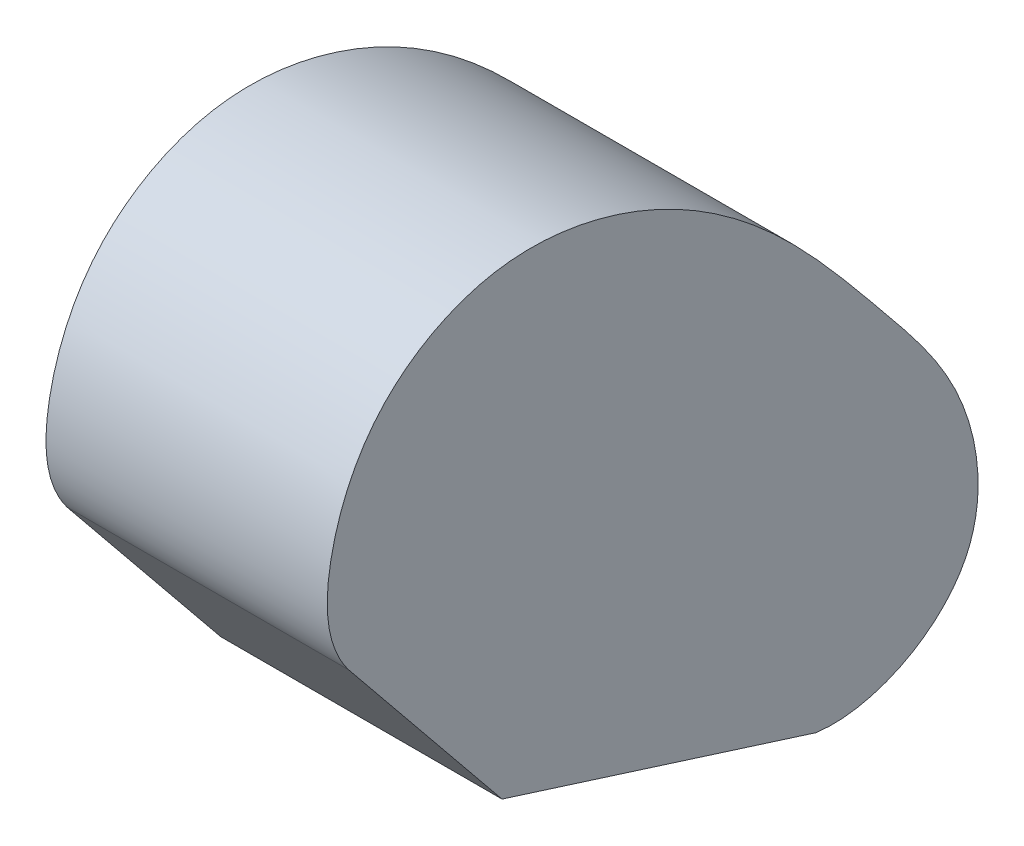
ISO-10303-21;
HEADER;
FILE_DESCRIPTION(('STEP AP214'),'2;1');
FILE_NAME('part.step','',(''),(''),'','','');
FILE_SCHEMA(('AUTOMOTIVE_DESIGN { 1 0 10303 214 1 1 1 1 }'));
ENDSEC;
DATA;
#1=APPLICATION_CONTEXT('core data for automotive mechanical design processes');
#2=APPLICATION_PROTOCOL_DEFINITION('international standard','automotive_design',2000,#1);
#3=PRODUCT_CONTEXT('',#1,'mechanical');
#4=PRODUCT('Part','Part','',(#3));
#5=PRODUCT_RELATED_PRODUCT_CATEGORY('part','',(#4));
#6=PRODUCT_DEFINITION_FORMATION('','',#4);
#7=PRODUCT_DEFINITION_CONTEXT('part definition',#1,'design');
#8=PRODUCT_DEFINITION('design','',#6,#7);
#9=PRODUCT_DEFINITION_SHAPE('','',#8);
#10=(LENGTH_UNIT() NAMED_UNIT(*) SI_UNIT(.MILLI.,.METRE.));
#11=(NAMED_UNIT(*) PLANE_ANGLE_UNIT() SI_UNIT($,.RADIAN.));
#12=(NAMED_UNIT(*) SI_UNIT($,.STERADIAN.) SOLID_ANGLE_UNIT());
#13=UNCERTAINTY_MEASURE_WITH_UNIT(LENGTH_MEASURE(1.E-05),#10,'distance_accuracy_value','');
#14=(GEOMETRIC_REPRESENTATION_CONTEXT(3) GLOBAL_UNCERTAINTY_ASSIGNED_CONTEXT((#13)) GLOBAL_UNIT_ASSIGNED_CONTEXT((#10,
#11,#12)) REPRESENTATION_CONTEXT('',''));
#15=CARTESIAN_POINT('',(0.,0.,0.));
#16=DIRECTION('',(0.,0.,1.));
#17=DIRECTION('',(1.,0.,0.));
#18=AXIS2_PLACEMENT_3D('',#15,#16,#17);
#19=CARTESIAN_POINT('',(-31.75,27.94,40.9761067500312));
#20=DIRECTION('',(0.,-0.630819115821945,0.775929921522311));
#21=DIRECTION('',(0.,-0.775929921522311,-0.630819115821945));
#22=AXIS2_PLACEMENT_3D('',#19,#20,#21);
#23=PLANE('',#22);
#24=DIRECTION('',(0.,-0.775929921522311,-0.630819115821945));
#25=VECTOR('',#24,1.);
#26=CARTESIAN_POINT('',(0.,27.94,40.9761067500312));
#27=LINE('',#26,#25);
#28=CARTESIAN_POINT('',(0.,49.2643519443853,58.312477556098));
#29=VERTEX_POINT('',#28);
#30=CARTESIAN_POINT('',(0.,27.94,40.9761067500312));
#31=VERTEX_POINT('',#30);
#32=EDGE_CURVE('E169',#29,#31,#27,.T.);
#33=ORIENTED_EDGE('',*,*,#32,.F.);
#34=DIRECTION('',(1.,0.,0.));
#35=VECTOR('',#34,1.);
#36=CARTESIAN_POINT('',(-31.75,49.2643519443853,58.312477556098));
#37=LINE('',#36,#35);
#38=CARTESIAN_POINT('',(-31.75,49.2643519443853,58.312477556098));
#39=VERTEX_POINT('',#38);
#40=EDGE_CURVE('E11',#39,#29,#37,.T.);
#41=ORIENTED_EDGE('',*,*,#40,.F.);
#42=DIRECTION('',(0.,-0.775929921522311,-0.630819115821945));
#43=VECTOR('',#42,1.);
#44=CARTESIAN_POINT('',(-31.75,27.94,40.9761067500312));
#45=LINE('',#44,#43);
#46=CARTESIAN_POINT('',(-31.75,27.94,40.9761067500312));
#47=VERTEX_POINT('',#46);
#48=EDGE_CURVE('E186',#39,#47,#45,.T.);
#49=ORIENTED_EDGE('',*,*,#48,.T.);
#50=DIRECTION('',(1.,0.,0.));
#51=VECTOR('',#50,1.);
#52=CARTESIAN_POINT('',(-31.75,27.94,40.9761067500312));
#53=LINE('',#52,#51);
#54=EDGE_CURVE('E42',#47,#31,#53,.T.);
#55=ORIENTED_EDGE('',*,*,#54,.T.);
#56=EDGE_LOOP('',(#33,#41,#49,#55));
#57=FACE_BOUND('',#56,.T.);
#58=ADVANCED_FACE('F39',(#57),#23,.T.);
#59=CARTESIAN_POINT('',(-31.75,16.7139818303603,5.54197032240626));
#60=CARTESIAN_POINT('',(-31.75,15.8257700396885,-0.93874411623954));
#61=CARTESIAN_POINT('',(-31.75,22.4496600064494,-14.4146521354421));
#62=CARTESIAN_POINT('',(-31.75,41.6895685775078,-12.200560018352));
#63=CARTESIAN_POINT('',(-31.75,55.1681957360806,-1.10441590440819));
#64=CARTESIAN_POINT('',(-31.75,69.3524212723375,10.3518692971981));
#65=CARTESIAN_POINT('',(-31.75,79.1513261886316,26.0626077224158));
#66=CARTESIAN_POINT('',(-31.75,81.505964049788,42.1636951200786));
#67=CARTESIAN_POINT('',(-31.75,74.0344326487383,55.5377323773982));
#68=CARTESIAN_POINT('',(-31.75,61.645538599711,61.1643579791778));
#69=CARTESIAN_POINT('',(-31.75,52.8133191500423,60.979470458901));
#70=CARTESIAN_POINT('',(-31.75,49.2643519443853,58.312477556098));
#71=B_SPLINE_CURVE_WITH_KNOTS('',3,(#59,#60,#61,#62,#63,#64,#65,#66,#67,#68,#69,#70),
.UNSPECIFIED.,.F.,.F.,(4,1,1,1,1,1,1,1,1,4),(0.,0.138773670260173,0.240892544513557,
0.351714633890988,0.50238750722408,0.616929549708268,0.730575478148498,0.822531503011914,
0.914096346149057,1.),.UNSPECIFIED.);
#72=DIRECTION('',(1.,0.,0.));
#73=VECTOR('',#72,1.);
#74=SURFACE_OF_LINEAR_EXTRUSION('',#71,#73);
#75=CARTESIAN_POINT('',(0.,16.7139818303603,5.54197032240626));
#76=CARTESIAN_POINT('',(0.,15.8257700396885,-0.93874411623954));
#77=CARTESIAN_POINT('',(0.,22.4496600064494,-14.4146521354421));
#78=CARTESIAN_POINT('',(0.,41.6895685775078,-12.200560018352));
#79=CARTESIAN_POINT('',(0.,55.1681957360806,-1.10441590440819));
#80=CARTESIAN_POINT('',(0.,69.3524212723375,10.3518692971981));
#81=CARTESIAN_POINT('',(0.,79.1513261886316,26.0626077224158));
#82=CARTESIAN_POINT('',(0.,81.505964049788,42.1636951200786));
#83=CARTESIAN_POINT('',(0.,74.0344326487383,55.5377323773982));
#84=CARTESIAN_POINT('',(0.,61.645538599711,61.1643579791778));
#85=CARTESIAN_POINT('',(0.,52.8133191500423,60.979470458901));
#86=CARTESIAN_POINT('',(0.,49.2643519443853,58.312477556098));
#87=B_SPLINE_CURVE_WITH_KNOTS('',3,(#75,#76,#77,#78,#79,#80,#81,#82,#83,#84,#85,#86),
.UNSPECIFIED.,.F.,.F.,(4,1,1,1,1,1,1,1,1,4),(0.,0.138773670260173,0.240892544513557,
0.351714633890988,0.50238750722408,0.616929549708268,0.730575478148498,0.822531503011914,
0.914096346149057,1.),.UNSPECIFIED.);
#88=CARTESIAN_POINT('',(0.,16.7139818303603,5.54197032240625));
#89=VERTEX_POINT('',#88);
#90=EDGE_CURVE('E181',#89,#29,#87,.T.);
#91=ORIENTED_EDGE('',*,*,#90,.F.);
#92=DIRECTION('',(1.,0.,0.));
#93=VECTOR('',#92,1.);
#94=CARTESIAN_POINT('',(-31.75,16.7139818303603,5.54197032240625));
#95=LINE('',#94,#93);
#96=CARTESIAN_POINT('',(-31.75,16.7139818303603,5.54197032240625));
#97=VERTEX_POINT('',#96);
#98=EDGE_CURVE('E48',#97,#89,#95,.T.);
#99=ORIENTED_EDGE('',*,*,#98,.F.);
#100=EDGE_CURVE('E160',#97,#39,#71,.T.);
#101=ORIENTED_EDGE('',*,*,#100,.T.);
#102=ORIENTED_EDGE('',*,*,#40,.T.);
#103=EDGE_LOOP('',(#91,#99,#101,#102));
#104=FACE_BOUND('',#103,.T.);
#105=ADVANCED_FACE('F157',(#104),#74,.T.);
#106=CARTESIAN_POINT('',(-31.75,27.94,40.9761067500312));
#107=DIRECTION('',(0.,-0.953301889031257,0.302019052990763));
#108=DIRECTION('',(0.,-0.302019052990763,-0.953301889031257));
#109=AXIS2_PLACEMENT_3D('',#106,#107,#108);
#110=PLANE('',#109);
#111=DIRECTION('',(0.,-0.302019052990763,-0.953301889031257));
#112=VECTOR('',#111,1.);
#113=CARTESIAN_POINT('',(0.,27.94,40.9761067500312));
#114=LINE('',#113,#112);
#115=EDGE_CURVE('E176',#31,#89,#114,.T.);
#116=ORIENTED_EDGE('',*,*,#115,.F.);
#117=ORIENTED_EDGE('',*,*,#54,.F.);
#118=DIRECTION('',(0.,-0.302019052990763,-0.953301889031257));
#119=VECTOR('',#118,1.);
#120=CARTESIAN_POINT('',(-31.75,27.94,40.9761067500312));
#121=LINE('',#120,#119);
#122=EDGE_CURVE('E167',#47,#97,#121,.T.);
#123=ORIENTED_EDGE('',*,*,#122,.T.);
#124=ORIENTED_EDGE('',*,*,#98,.T.);
#125=EDGE_LOOP('',(#116,#117,#123,#124));
#126=FACE_BOUND('',#125,.T.);
#127=ADVANCED_FACE('F152',(#126),#110,.T.);
#128=CARTESIAN_POINT('',(-31.75,69.4777145382106,12.1321601386259));
#129=DIRECTION('',(1.,0.,0.));
#130=DIRECTION('',(0.,0.,-1.));
#131=AXIS2_PLACEMENT_3D('',#128,#129,#130);
#132=PLANE('',#131);
#133=DIRECTION('',(0.,-1.,0.));
#134=VECTOR('',#133,1.);
#135=CARTESIAN_POINT('',(-31.75,63.410804486409,12.8234805598399));
#136=LINE('',#135,#134);
#137=CARTESIAN_POINT('',(-31.75,63.410804486409,12.8234805598399));
#138=VERTEX_POINT('',#137);
#139=CARTESIAN_POINT('',(-31.75,30.58978975289,12.8234805598399));
#140=VERTEX_POINT('',#139);
#141=EDGE_CURVE('E207',#138,#140,#136,.T.);
#142=ORIENTED_EDGE('',*,*,#141,.F.);
#143=CARTESIAN_POINT('',(-31.75,47.8384152122371,51.6195373875074));
#144=CARTESIAN_POINT('',(-31.75,53.9482148395167,54.3503846767443));
#145=CARTESIAN_POINT('',(-31.75,66.018283328843,53.4270669989732));
#146=CARTESIAN_POINT('',(-31.75,74.4906652450099,41.354678146208));
#147=CARTESIAN_POINT('',(-31.75,74.5632920252441,31.2474909533349));
#148=CARTESIAN_POINT('',(-31.75,70.0986451120216,21.7663813350309));
#149=CARTESIAN_POINT('',(-31.75,66.3056914684199,16.0755247430949));
#150=CARTESIAN_POINT('',(-31.75,63.410804486409,12.8234805598399));
#151=B_SPLINE_CURVE_WITH_KNOTS('',3,(#143,#144,#145,#146,#147,#148,#149,#150),.UNSPECIFIED.,.F.,
.F.,(4,1,1,1,1,4),(0.403518167525159,0.598310091259876,0.700311118284575,0.801467340452435,
0.874270530045247,1.),.UNSPECIFIED.);
#152=CARTESIAN_POINT('',(-31.75,47.8384152122371,51.6195373875074));
#153=VERTEX_POINT('',#152);
#154=EDGE_CURVE('E56',#153,#138,#151,.T.);
#155=ORIENTED_EDGE('',*,*,#154,.F.);
#156=DIRECTION('',(0.,0.806875770964733,0.590721161149716));
#157=VECTOR('',#156,1.);
#158=CARTESIAN_POINT('',(-31.75,47.8384152122371,51.6195373875074));
#159=LINE('',#158,#157);
#160=CARTESIAN_POINT('',(-31.75,30.58978975289,38.9916603012992));
#161=VERTEX_POINT('',#160);
#162=EDGE_CURVE('E129',#161,#153,#159,.T.);
#163=ORIENTED_EDGE('',*,*,#162,.F.);
#164=DIRECTION('',(0.,0.,1.));
#165=VECTOR('',#164,1.);
#166=CARTESIAN_POINT('',(-31.75,30.58978975289,38.9916603012992));
#167=LINE('',#166,#165);
#168=EDGE_CURVE('E133',#140,#161,#167,.T.);
#169=ORIENTED_EDGE('',*,*,#168,.F.);
#170=EDGE_LOOP('',(#142,#155,#163,#169));
#171=FACE_BOUND('',#170,.T.);
#172=ORIENTED_EDGE('',*,*,#48,.F.);
#173=ORIENTED_EDGE('',*,*,#100,.F.);
#174=ORIENTED_EDGE('',*,*,#122,.F.);
#175=EDGE_LOOP('',(#172,#173,#174));
#176=FACE_BOUND('',#175,.T.);
#177=ADVANCED_FACE('F149',(#171,#176),#132,.F.);
#178=CARTESIAN_POINT('',(0.,69.4777145382106,12.1321601386259));
#179=DIRECTION('',(1.,0.,0.));
#180=DIRECTION('',(0.,0.,-1.));
#181=AXIS2_PLACEMENT_3D('',#178,#179,#180);
#182=PLANE('',#181);
#183=ORIENTED_EDGE('',*,*,#32,.T.);
#184=ORIENTED_EDGE('',*,*,#115,.T.);
#185=ORIENTED_EDGE('',*,*,#90,.T.);
#186=EDGE_LOOP('',(#183,#184,#185));
#187=FACE_BOUND('',#186,.T.);
#188=ADVANCED_FACE('F147',(#187),#182,.T.);
#189=CARTESIAN_POINT('',(-5.08,47.8384152122371,51.6195373875074));
#190=CARTESIAN_POINT('',(-5.08,53.9482148395167,54.3503846767443));
#191=CARTESIAN_POINT('',(-5.08,66.018283328843,53.4270669989732));
#192=CARTESIAN_POINT('',(-5.08,74.4906652450099,41.354678146208));
#193=CARTESIAN_POINT('',(-5.08,74.5632920252441,31.2474909533349));
#194=CARTESIAN_POINT('',(-5.08,70.0986451120216,21.7663813350309));
#195=CARTESIAN_POINT('',(-5.08,66.3056914684199,16.0755247430949));
#196=CARTESIAN_POINT('',(-5.08,63.410804486409,12.8234805598399));
#197=B_SPLINE_CURVE_WITH_KNOTS('',3,(#189,#190,#191,#192,#193,#194,#195,#196),.UNSPECIFIED.,.F.,
.F.,(4,1,1,1,1,4),(0.403518167525159,0.598310091259876,0.700311118284575,0.801467340452435,
0.874270530045247,1.),.UNSPECIFIED.);
#198=DIRECTION('',(-1.,0.,0.));
#199=VECTOR('',#198,1.);
#200=SURFACE_OF_LINEAR_EXTRUSION('',#197,#199);
#201=ORIENTED_EDGE('',*,*,#154,.T.);
#202=DIRECTION('',(-1.,0.,0.));
#203=VECTOR('',#202,1.);
#204=CARTESIAN_POINT('',(-5.08,63.410804486409,12.8234805598399));
#205=LINE('',#204,#203);
#206=CARTESIAN_POINT('',(-5.08,63.410804486409,12.8234805598399));
#207=VERTEX_POINT('',#206);
#208=EDGE_CURVE('E104',#207,#138,#205,.T.);
#209=ORIENTED_EDGE('',*,*,#208,.F.);
#210=CARTESIAN_POINT('',(-5.08,47.8384152122371,51.6195373875074));
#211=VERTEX_POINT('',#210);
#212=EDGE_CURVE('E108',#211,#207,#197,.T.);
#213=ORIENTED_EDGE('',*,*,#212,.F.);
#214=DIRECTION('',(-1.,0.,0.));
#215=VECTOR('',#214,1.);
#216=CARTESIAN_POINT('',(-5.08,47.8384152122371,51.6195373875074));
#217=LINE('',#216,#215);
#218=EDGE_CURVE('E177',#211,#153,#217,.T.);
#219=ORIENTED_EDGE('',*,*,#218,.T.);
#220=EDGE_LOOP('',(#201,#209,#213,#219));
#221=FACE_BOUND('',#220,.T.);
#222=ADVANCED_FACE('F106',(#221),#200,.F.);
#223=CARTESIAN_POINT('',(-5.08,47.8384152122371,51.6195373875074));
#224=DIRECTION('',(0.,-0.590721161149716,0.806875770964733));
#225=DIRECTION('',(0.,-0.806875770964733,-0.590721161149716));
#226=AXIS2_PLACEMENT_3D('',#223,#224,#225);
#227=PLANE('',#226);
#228=ORIENTED_EDGE('',*,*,#162,.T.);
#229=ORIENTED_EDGE('',*,*,#218,.F.);
#230=DIRECTION('',(0.,0.806875770964733,0.590721161149716));
#231=VECTOR('',#230,1.);
#232=CARTESIAN_POINT('',(-5.08,47.8384152122371,51.6195373875074));
#233=LINE('',#232,#231);
#234=CARTESIAN_POINT('',(-5.08,30.58978975289,38.9916603012992));
#235=VERTEX_POINT('',#234);
#236=EDGE_CURVE('E115',#235,#211,#233,.T.);
#237=ORIENTED_EDGE('',*,*,#236,.F.);
#238=DIRECTION('',(-1.,0.,0.));
#239=VECTOR('',#238,1.);
#240=CARTESIAN_POINT('',(-5.08,30.58978975289,38.9916603012992));
#241=LINE('',#240,#239);
#242=EDGE_CURVE('E199',#235,#161,#241,.T.);
#243=ORIENTED_EDGE('',*,*,#242,.T.);
#244=EDGE_LOOP('',(#228,#229,#237,#243));
#245=FACE_BOUND('',#244,.T.);
#246=ADVANCED_FACE('F146',(#245),#227,.F.);
#247=CARTESIAN_POINT('',(-5.08,30.58978975289,38.9916603012992));
#248=DIRECTION('',(0.,-1.,0.));
#249=DIRECTION('',(0.,0.,-1.));
#250=AXIS2_PLACEMENT_3D('',#247,#248,#249);
#251=PLANE('',#250);
#252=ORIENTED_EDGE('',*,*,#168,.T.);
#253=ORIENTED_EDGE('',*,*,#242,.F.);
#254=DIRECTION('',(0.,0.,1.));
#255=VECTOR('',#254,1.);
#256=CARTESIAN_POINT('',(-5.08,30.58978975289,38.9916603012992));
#257=LINE('',#256,#255);
#258=CARTESIAN_POINT('',(-5.08,30.58978975289,12.8234805598399));
#259=VERTEX_POINT('',#258);
#260=EDGE_CURVE('E124',#259,#235,#257,.T.);
#261=ORIENTED_EDGE('',*,*,#260,.F.);
#262=DIRECTION('',(-1.,0.,0.));
#263=VECTOR('',#262,1.);
#264=CARTESIAN_POINT('',(-5.08,30.58978975289,12.8234805598399));
#265=LINE('',#264,#263);
#266=EDGE_CURVE('E114',#259,#140,#265,.T.);
#267=ORIENTED_EDGE('',*,*,#266,.T.);
#268=EDGE_LOOP('',(#252,#253,#261,#267));
#269=FACE_BOUND('',#268,.T.);
#270=ADVANCED_FACE('F223',(#269),#251,.F.);
#271=CARTESIAN_POINT('',(-5.08,63.410804486409,12.8234805598399));
#272=DIRECTION('',(0.,0.,-1.));
#273=DIRECTION('',(0.,1.,0.));
#274=AXIS2_PLACEMENT_3D('',#271,#272,#273);
#275=PLANE('',#274);
#276=ORIENTED_EDGE('',*,*,#141,.T.);
#277=ORIENTED_EDGE('',*,*,#266,.F.);
#278=DIRECTION('',(0.,-1.,0.));
#279=VECTOR('',#278,1.);
#280=CARTESIAN_POINT('',(-5.08,63.410804486409,12.8234805598399));
#281=LINE('',#280,#279);
#282=EDGE_CURVE('E118',#207,#259,#281,.T.);
#283=ORIENTED_EDGE('',*,*,#282,.F.);
#284=ORIENTED_EDGE('',*,*,#208,.T.);
#285=EDGE_LOOP('',(#276,#277,#283,#284));
#286=FACE_BOUND('',#285,.T.);
#287=ADVANCED_FACE('F119',(#286),#275,.F.);
#288=CARTESIAN_POINT('',(-5.08,73.4777797102245,40.8612868257488));
#289=DIRECTION('',(-1.,0.,0.));
#290=DIRECTION('',(0.,0.,1.));
#291=AXIS2_PLACEMENT_3D('',#288,#289,#290);
#292=PLANE('',#291);
#293=ORIENTED_EDGE('',*,*,#212,.T.);
#294=ORIENTED_EDGE('',*,*,#282,.T.);
#295=ORIENTED_EDGE('',*,*,#260,.T.);
#296=ORIENTED_EDGE('',*,*,#236,.T.);
#297=EDGE_LOOP('',(#293,#294,#295,#296));
#298=FACE_BOUND('',#297,.T.);
#299=ADVANCED_FACE('F126',(#298),#292,.T.);
#300=CLOSED_SHELL('',(#58,#105,#127,#177,#188,#222,#246,#270,#287,#299));
#301=MANIFOLD_SOLID_BREP('B2',#300);
#302=ADVANCED_BREP_SHAPE_REPRESENTATION('',(#18,#301),#14);
#303=SHAPE_DEFINITION_REPRESENTATION(#9,#302);
ENDSEC;
END-ISO-10303-21;
